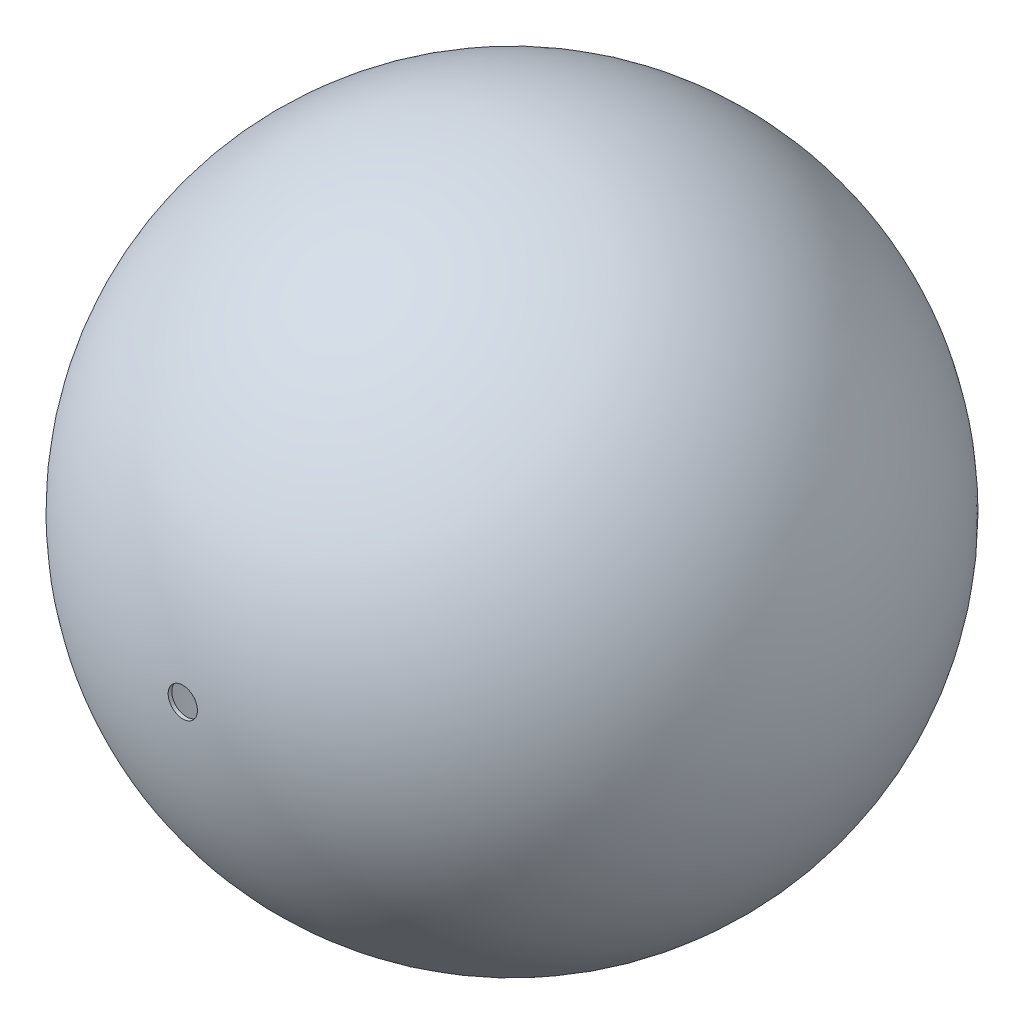
ISO-10303-21;
HEADER;
FILE_DESCRIPTION(('STEP AP214'),'2;1');
FILE_NAME('part.step','',(''),(''),'','','');
FILE_SCHEMA(('AUTOMOTIVE_DESIGN { 1 0 10303 214 1 1 1 1 }'));
ENDSEC;
DATA;
#1=APPLICATION_CONTEXT('core data for automotive mechanical design processes');
#2=APPLICATION_PROTOCOL_DEFINITION('international standard','automotive_design',2000,#1);
#3=PRODUCT_CONTEXT('',#1,'mechanical');
#4=PRODUCT('Part','Part','',(#3));
#5=PRODUCT_RELATED_PRODUCT_CATEGORY('part','',(#4));
#6=PRODUCT_DEFINITION_FORMATION('','',#4);
#7=PRODUCT_DEFINITION_CONTEXT('part definition',#1,'design');
#8=PRODUCT_DEFINITION('design','',#6,#7);
#9=PRODUCT_DEFINITION_SHAPE('','',#8);
#10=(LENGTH_UNIT() NAMED_UNIT(*) SI_UNIT(.MILLI.,.METRE.));
#11=(NAMED_UNIT(*) PLANE_ANGLE_UNIT() SI_UNIT($,.RADIAN.));
#12=(NAMED_UNIT(*) SI_UNIT($,.STERADIAN.) SOLID_ANGLE_UNIT());
#13=UNCERTAINTY_MEASURE_WITH_UNIT(LENGTH_MEASURE(1.E-05),#10,'distance_accuracy_value','');
#14=(GEOMETRIC_REPRESENTATION_CONTEXT(3) GLOBAL_UNCERTAINTY_ASSIGNED_CONTEXT((#13)) GLOBAL_UNIT_ASSIGNED_CONTEXT((#10,
#11,#12)) REPRESENTATION_CONTEXT('',''));
#15=CARTESIAN_POINT('',(0.,0.,0.));
#16=DIRECTION('',(0.,0.,1.));
#17=DIRECTION('',(1.,0.,0.));
#18=AXIS2_PLACEMENT_3D('',#15,#16,#17);
#19=CARTESIAN_POINT('',(0.,0.,0.));
#20=DIRECTION('',(0.,1.,0.));
#21=DIRECTION('',(1.,0.,0.));
#22=AXIS2_PLACEMENT_3D('',#19,#20,#21);
#23=SPHERICAL_SURFACE('',#22,89.);
#24=CARTESIAN_POINT('',(0.,0.,0.));
#25=DIRECTION('',(0.,0.,-1.));
#26=DIRECTION('',(-1.,0.,0.));
#27=AXIS2_PLACEMENT_3D('',#24,#25,#26);
#28=SPHERICAL_SURFACE('',#27,89.);
#29=CARTESIAN_POINT('',(0.,0.,88.9100669215809));
#30=DIRECTION('',(0.,0.,-1.));
#31=DIRECTION('',(-1.,0.,0.));
#32=AXIS2_PLACEMENT_3D('',#29,#30,#31);
#33=CIRCLE('',#32,4.);
#34=CARTESIAN_POINT('',(4.,0.,88.9100669215809));
#35=VERTEX_POINT('',#34);
#36=EDGE_CURVE('E35',#35,#35,#33,.F.);
#37=ORIENTED_EDGE('',*,*,#36,.T.);
#38=EDGE_LOOP('',(#37));
#39=FACE_BOUND('',#38,.T.);
#40=CARTESIAN_POINT('',(0.,0.,-88.9100669215809));
#41=DIRECTION('',(0.,0.,1.));
#42=DIRECTION('',(1.,0.,0.));
#43=AXIS2_PLACEMENT_3D('',#40,#41,#42);
#44=CIRCLE('',#43,4.);
#45=CARTESIAN_POINT('',(4.,0.,-88.9100669215809));
#46=VERTEX_POINT('',#45);
#47=EDGE_CURVE('E45',#46,#46,#44,.F.);
#48=ORIENTED_EDGE('',*,*,#47,.T.);
#49=EDGE_LOOP('',(#48));
#50=FACE_BOUND('',#49,.T.);
#51=ADVANCED_FACE('F31',(#39,#50),#28,.F.);
#52=CARTESIAN_POINT('',(0.,0.,-90.));
#53=DIRECTION('',(0.,0.,1.));
#54=DIRECTION('',(1.,0.,0.));
#55=AXIS2_PLACEMENT_3D('',#52,#53,#54);
#56=CYLINDRICAL_SURFACE('',#55,4.);
#57=CARTESIAN_POINT('',(0.,0.,-89.9110671719561));
#58=DIRECTION('',(0.,0.,1.));
#59=DIRECTION('',(1.,0.,0.));
#60=AXIS2_PLACEMENT_3D('',#57,#58,#59);
#61=CIRCLE('',#60,4.);
#62=CARTESIAN_POINT('',(4.,0.,-89.9110671719561));
#63=VERTEX_POINT('',#62);
#64=EDGE_CURVE('E39',#63,#63,#61,.F.);
#65=CARTESIAN_POINT('',(4.,0.,-89.9110671719561));
#66=CARTESIAN_POINT('',(4.,0.,-89.9006400860147));
#67=CARTESIAN_POINT('',(4.,0.,-89.8902130000733));
#68=CARTESIAN_POINT('',(4.,0.,-89.8693588281905));
#69=CARTESIAN_POINT('',(4.,0.,-89.8589317422491));
#70=CARTESIAN_POINT('',(4.,0.,-89.8380775703663));
#71=CARTESIAN_POINT('',(4.,0.,-89.8276504844248));
#72=CARTESIAN_POINT('',(4.,0.,-89.806796312542));
#73=CARTESIAN_POINT('',(4.,0.,-89.7963692266006));
#74=CARTESIAN_POINT('',(4.,0.,-89.7755150547178));
#75=CARTESIAN_POINT('',(4.,0.,-89.7650879687764));
#76=CARTESIAN_POINT('',(4.,0.,-89.7442337968936));
#77=CARTESIAN_POINT('',(4.,0.,-89.7338067109522));
#78=CARTESIAN_POINT('',(4.,0.,-89.7129525390694));
#79=CARTESIAN_POINT('',(4.,0.,-89.702525453128));
#80=CARTESIAN_POINT('',(4.,0.,-89.6816712812451));
#81=CARTESIAN_POINT('',(4.,0.,-89.6712441953037));
#82=CARTESIAN_POINT('',(4.,0.,-89.6503900234209));
#83=CARTESIAN_POINT('',(4.,0.,-89.6399629374795));
#84=CARTESIAN_POINT('',(4.,0.,-89.6191087655967));
#85=CARTESIAN_POINT('',(4.,0.,-89.6086816796553));
#86=CARTESIAN_POINT('',(4.,0.,-89.5878275077725));
#87=CARTESIAN_POINT('',(4.,0.,-89.5774004218311));
#88=CARTESIAN_POINT('',(4.,0.,-89.5565462499482));
#89=CARTESIAN_POINT('',(4.,0.,-89.5461191640068));
#90=CARTESIAN_POINT('',(4.,0.,-89.525264992124));
#91=CARTESIAN_POINT('',(4.,0.,-89.5148379061826));
#92=CARTESIAN_POINT('',(4.,0.,-89.4939837342998));
#93=CARTESIAN_POINT('',(4.,0.,-89.4835566483584));
#94=CARTESIAN_POINT('',(4.,0.,-89.4627024764756));
#95=CARTESIAN_POINT('',(4.,0.,-89.4522753905342));
#96=CARTESIAN_POINT('',(4.,0.,-89.4314212186513));
#97=CARTESIAN_POINT('',(4.,0.,-89.42099413271));
#98=CARTESIAN_POINT('',(4.,0.,-89.4001399608271));
#99=CARTESIAN_POINT('',(4.,0.,-89.3897128748857));
#100=CARTESIAN_POINT('',(4.,0.,-89.3688587030029));
#101=CARTESIAN_POINT('',(4.,0.,-89.3584316170615));
#102=CARTESIAN_POINT('',(4.,0.,-89.3375774451787));
#103=CARTESIAN_POINT('',(4.,0.,-89.3271503592373));
#104=CARTESIAN_POINT('',(4.,0.,-89.3062961873544));
#105=CARTESIAN_POINT('',(4.,0.,-89.295869101413));
#106=CARTESIAN_POINT('',(4.,0.,-89.2750149295302));
#107=CARTESIAN_POINT('',(4.,0.,-89.2645878435888));
#108=CARTESIAN_POINT('',(4.,0.,-89.243733671706));
#109=CARTESIAN_POINT('',(4.,0.,-89.2333065857646));
#110=CARTESIAN_POINT('',(4.,0.,-89.2124524138818));
#111=CARTESIAN_POINT('',(4.,0.,-89.2020253279404));
#112=CARTESIAN_POINT('',(4.,0.,-89.1811711560576));
#113=CARTESIAN_POINT('',(4.,0.,-89.1707440701161));
#114=CARTESIAN_POINT('',(4.,0.,-89.1498898982333));
#115=CARTESIAN_POINT('',(4.,0.,-89.1394628122919));
#116=CARTESIAN_POINT('',(4.,0.,-89.1186086404091));
#117=CARTESIAN_POINT('',(4.,0.,-89.1081815544677));
#118=CARTESIAN_POINT('',(4.,0.,-89.0873273825849));
#119=CARTESIAN_POINT('',(4.,0.,-89.0769002966435));
#120=CARTESIAN_POINT('',(4.,0.,-89.0560461247607));
#121=CARTESIAN_POINT('',(4.,0.,-89.0456190388193));
#122=CARTESIAN_POINT('',(4.,0.,-89.0247648669364));
#123=CARTESIAN_POINT('',(4.,0.,-89.014337780995));
#124=CARTESIAN_POINT('',(4.,0.,-88.9934836091122));
#125=CARTESIAN_POINT('',(4.,0.,-88.9830565231708));
#126=CARTESIAN_POINT('',(4.,0.,-88.962202351288));
#127=CARTESIAN_POINT('',(4.,0.,-88.9517752653466));
#128=CARTESIAN_POINT('',(4.,0.,-88.9309210934638));
#129=CARTESIAN_POINT('',(4.,0.,-88.9204940075224));
#130=CARTESIAN_POINT('',(4.,0.,-88.9100669215809));
#131=B_SPLINE_CURVE_WITH_KNOTS('',3,(#65,#66,#67,#68,#69,#70,#71,#72,#73,#74,#75,#76,#77,#78,
#79,#80,#81,#82,#83,#84,#85,#86,#87,#88,#89,#90,#91,#92,#93,#94,#95,#96,#97,#98,#99,#100,#101,
#102,#103,#104,#105,#106,#107,#108,#109,#110,#111,#112,#113,#114,#115,#116,#117,#118,#119,#120,
#121,#122,#123,#124,#125,#126,#127,#128,#129,#130),.UNSPECIFIED.,.F.,.F.,(4,2,2,2,2,2,2,2,2,2,2,
2,2,2,2,2,2,2,2,2,2,2,2,2,2,2,2,2,2,2,2,2,4),(0.,0.0312812578242283,0.0625625156484566,
0.093843773472671,0.125125031296899,0.156406289121128,0.187687546945342,0.21896880476957,
0.250250062593799,0.281531320418013,0.312812578242241,0.34409383606647,0.375375093890684,
0.406656351714912,0.437937609539141,0.469218867363355,0.500500125187583,0.531781383011812,
0.563062640836026,0.594343898660254,0.625625156484483,0.656906414308697,0.688187672132926,
0.719468929957154,0.750750187781368,0.782031445605597,0.813312703429825,0.844593961254039,
0.875875219078268,0.907156476902496,0.93843773472671,0.969718992550939,1.00100025037517),.UNSPECIFIED.);
#132=EDGE_CURVE('BSEAM55',#63,#46,#131,.T.);
#133=ORIENTED_EDGE('',*,*,#64,.T.);
#134=ORIENTED_EDGE('',*,*,#47,.F.);
#135=ORIENTED_EDGE('',*,*,#132,.T.);
#136=ORIENTED_EDGE('',*,*,#132,.F.);
#137=EDGE_LOOP('',(#133,#135,#134,#136));
#138=FACE_BOUND('',#137,.T.);
#139=ADVANCED_FACE('F55',(#138),#56,.F.);
#140=CARTESIAN_POINT('',(0.,0.,89.911067171956));
#141=DIRECTION('',(0.,0.,-1.));
#142=DIRECTION('',(-1.,0.,0.));
#143=AXIS2_PLACEMENT_3D('',#140,#141,#142);
#144=CIRCLE('',#143,4.);
#145=CARTESIAN_POINT('',(4.,0.,89.9110671719561));
#146=VERTEX_POINT('',#145);
#147=EDGE_CURVE('E10',#146,#146,#144,.F.);
#148=CARTESIAN_POINT('',(4.,0.,89.9110671719561));
#149=CARTESIAN_POINT('',(4.,0.,89.9006400860147));
#150=CARTESIAN_POINT('',(4.,0.,89.8902130000733));
#151=CARTESIAN_POINT('',(4.,0.,89.8693588281904));
#152=CARTESIAN_POINT('',(4.,0.,89.858931742249));
#153=CARTESIAN_POINT('',(4.,0.,89.8380775703662));
#154=CARTESIAN_POINT('',(4.,0.,89.8276504844248));
#155=CARTESIAN_POINT('',(4.,0.,89.806796312542));
#156=CARTESIAN_POINT('',(4.,0.,89.7963692266006));
#157=CARTESIAN_POINT('',(4.,0.,89.7755150547178));
#158=CARTESIAN_POINT('',(4.,0.,89.7650879687764));
#159=CARTESIAN_POINT('',(4.,0.,89.7442337968935));
#160=CARTESIAN_POINT('',(4.,0.,89.7338067109521));
#161=CARTESIAN_POINT('',(4.,0.,89.7129525390693));
#162=CARTESIAN_POINT('',(4.,0.,89.7025254531279));
#163=CARTESIAN_POINT('',(4.,0.,89.6816712812451));
#164=CARTESIAN_POINT('',(4.,0.,89.6712441953037));
#165=CARTESIAN_POINT('',(4.,0.,89.6503900234209));
#166=CARTESIAN_POINT('',(4.,0.,89.6399629374795));
#167=CARTESIAN_POINT('',(4.,0.,89.6191087655966));
#168=CARTESIAN_POINT('',(4.,0.,89.6086816796552));
#169=CARTESIAN_POINT('',(4.,0.,89.5878275077724));
#170=CARTESIAN_POINT('',(4.,0.,89.577400421831));
#171=CARTESIAN_POINT('',(4.,0.,89.5565462499482));
#172=CARTESIAN_POINT('',(4.,0.,89.5461191640068));
#173=CARTESIAN_POINT('',(4.,0.,89.525264992124));
#174=CARTESIAN_POINT('',(4.,0.,89.5148379061826));
#175=CARTESIAN_POINT('',(4.,0.,89.4939837342997));
#176=CARTESIAN_POINT('',(4.,0.,89.4835566483583));
#177=CARTESIAN_POINT('',(4.,0.,89.4627024764755));
#178=CARTESIAN_POINT('',(4.,0.,89.4522753905341));
#179=CARTESIAN_POINT('',(4.,0.,89.4314212186513));
#180=CARTESIAN_POINT('',(4.,0.,89.4209941327099));
#181=CARTESIAN_POINT('',(4.,0.,89.4001399608271));
#182=CARTESIAN_POINT('',(4.,0.,89.3897128748857));
#183=CARTESIAN_POINT('',(4.,0.,89.3688587030028));
#184=CARTESIAN_POINT('',(4.,0.,89.3584316170614));
#185=CARTESIAN_POINT('',(4.,0.,89.3375774451786));
#186=CARTESIAN_POINT('',(4.,0.,89.3271503592372));
#187=CARTESIAN_POINT('',(4.,0.,89.3062961873544));
#188=CARTESIAN_POINT('',(4.,0.,89.295869101413));
#189=CARTESIAN_POINT('',(4.,0.,89.2750149295302));
#190=CARTESIAN_POINT('',(4.,0.,89.2645878435888));
#191=CARTESIAN_POINT('',(4.,0.,89.2437336717059));
#192=CARTESIAN_POINT('',(4.,0.,89.2333065857646));
#193=CARTESIAN_POINT('',(4.,0.,89.2124524138817));
#194=CARTESIAN_POINT('',(4.,0.,89.2020253279403));
#195=CARTESIAN_POINT('',(4.,0.,89.1811711560575));
#196=CARTESIAN_POINT('',(4.,0.,89.1707440701161));
#197=CARTESIAN_POINT('',(4.,0.,89.1498898982333));
#198=CARTESIAN_POINT('',(4.,0.,89.1394628122919));
#199=CARTESIAN_POINT('',(4.,0.,89.118608640409));
#200=CARTESIAN_POINT('',(4.,0.,89.1081815544676));
#201=CARTESIAN_POINT('',(4.,0.,89.0873273825848));
#202=CARTESIAN_POINT('',(4.,0.,89.0769002966434));
#203=CARTESIAN_POINT('',(4.,0.,89.0560461247606));
#204=CARTESIAN_POINT('',(4.,0.,89.0456190388192));
#205=CARTESIAN_POINT('',(4.,0.,89.0247648669364));
#206=CARTESIAN_POINT('',(4.,0.,89.014337780995));
#207=CARTESIAN_POINT('',(4.,0.,88.9934836091121));
#208=CARTESIAN_POINT('',(4.,0.,88.9830565231707));
#209=CARTESIAN_POINT('',(4.,0.,88.9622023512879));
#210=CARTESIAN_POINT('',(4.,0.,88.9517752653465));
#211=CARTESIAN_POINT('',(4.,0.,88.9309210934637));
#212=CARTESIAN_POINT('',(4.,0.,88.9204940075223));
#213=CARTESIAN_POINT('',(4.,0.,88.9100669215809));
#214=B_SPLINE_CURVE_WITH_KNOTS('',3,(#148,#149,#150,#151,#152,#153,#154,#155,#156,#157,#158,
#159,#160,#161,#162,#163,#164,#165,#166,#167,#168,#169,#170,#171,#172,#173,#174,#175,#176,#177,
#178,#179,#180,#181,#182,#183,#184,#185,#186,#187,#188,#189,#190,#191,#192,#193,#194,#195,#196,
#197,#198,#199,#200,#201,#202,#203,#204,#205,#206,#207,#208,#209,#210,#211,#212,#213),
.UNSPECIFIED.,.F.,.F.,(4,2,2,2,2,2,2,2,2,2,2,2,2,2,2,2,2,2,2,2,2,2,2,2,2,2,2,2,2,2,2,2,4),(0.,
0.0312812578242283,0.0625625156484566,0.0938437734726849,0.125125031296913,0.156406289121114,
0.187687546945342,0.21896880476957,0.250250062593799,0.281531320418027,0.312812578242255,
0.344093836066484,0.375375093890684,0.406656351714912,0.437937609539141,0.469218867363369,
0.500500125187597,0.531781383011826,0.563062640836054,0.594343898660282,0.625625156484511,
0.656906414308711,0.688187672132939,0.719468929957168,0.750750187781396,0.782031445605624,
0.813312703429853,0.844593961254081,0.875875219078281,0.90715647690251,0.938437734726738,
0.969718992550966,1.00100025037519),.UNSPECIFIED.);
#215=EDGE_CURVE('BSEAM53',#146,#35,#214,.T.);
#216=ORIENTED_EDGE('',*,*,#147,.T.);
#217=ORIENTED_EDGE('',*,*,#36,.F.);
#218=ORIENTED_EDGE('',*,*,#215,.T.);
#219=ORIENTED_EDGE('',*,*,#215,.F.);
#220=EDGE_LOOP('',(#216,#218,#217,#219));
#221=FACE_BOUND('',#220,.T.);
#222=ADVANCED_FACE('F53',(#221),#56,.F.);
#223=CARTESIAN_POINT('',(0.,0.,0.));
#224=DIRECTION('',(0.,1.,0.));
#225=DIRECTION('',(1.,0.,0.));
#226=AXIS2_PLACEMENT_3D('',#223,#224,#225);
#227=SPHERICAL_SURFACE('',#226,90.);
#228=CARTESIAN_POINT('',(0.,0.,0.));
#229=DIRECTION('',(0.,0.,-1.));
#230=DIRECTION('',(-1.,0.,0.));
#231=AXIS2_PLACEMENT_3D('',#228,#229,#230);
#232=SPHERICAL_SURFACE('',#231,90.);
#233=ORIENTED_EDGE('',*,*,#147,.F.);
#234=EDGE_LOOP('',(#233));
#235=FACE_BOUND('',#234,.T.);
#236=ORIENTED_EDGE('',*,*,#64,.F.);
#237=EDGE_LOOP('',(#236));
#238=FACE_BOUND('',#237,.T.);
#239=ADVANCED_FACE('F33',(#235,#238),#232,.T.);
#240=CLOSED_SHELL('',(#51,#139,#222,#239));
#241=MANIFOLD_SOLID_BREP('B2',#240);
#242=ADVANCED_BREP_SHAPE_REPRESENTATION('',(#18,#241),#14);
#243=SHAPE_DEFINITION_REPRESENTATION(#9,#242);
ENDSEC;
END-ISO-10303-21;
